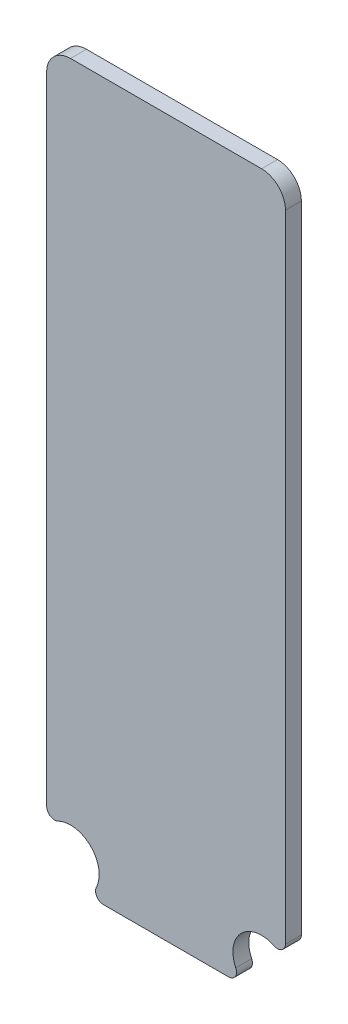
ISO-10303-21;
HEADER;
FILE_DESCRIPTION(('STEP AP214'),'2;1');
FILE_NAME('part.step','',(''),(''),'','','');
FILE_SCHEMA(('AUTOMOTIVE_DESIGN { 1 0 10303 214 1 1 1 1 }'));
ENDSEC;
DATA;
#1=APPLICATION_CONTEXT('core data for automotive mechanical design processes');
#2=APPLICATION_PROTOCOL_DEFINITION('international standard','automotive_design',2000,#1);
#3=PRODUCT_CONTEXT('',#1,'mechanical');
#4=PRODUCT('Part','Part','',(#3));
#5=PRODUCT_RELATED_PRODUCT_CATEGORY('part','',(#4));
#6=PRODUCT_DEFINITION_FORMATION('','',#4);
#7=PRODUCT_DEFINITION_CONTEXT('part definition',#1,'design');
#8=PRODUCT_DEFINITION('design','',#6,#7);
#9=PRODUCT_DEFINITION_SHAPE('','',#8);
#10=(LENGTH_UNIT() NAMED_UNIT(*) SI_UNIT(.MILLI.,.METRE.));
#11=(NAMED_UNIT(*) PLANE_ANGLE_UNIT() SI_UNIT($,.RADIAN.));
#12=(NAMED_UNIT(*) SI_UNIT($,.STERADIAN.) SOLID_ANGLE_UNIT());
#13=UNCERTAINTY_MEASURE_WITH_UNIT(LENGTH_MEASURE(1.E-05),#10,'distance_accuracy_value','');
#14=(GEOMETRIC_REPRESENTATION_CONTEXT(3) GLOBAL_UNCERTAINTY_ASSIGNED_CONTEXT((#13)) GLOBAL_UNIT_ASSIGNED_CONTEXT((#10,
#11,#12)) REPRESENTATION_CONTEXT('',''));
#15=CARTESIAN_POINT('',(0.,0.,0.));
#16=DIRECTION('',(0.,0.,1.));
#17=DIRECTION('',(1.,0.,0.));
#18=AXIS2_PLACEMENT_3D('',#15,#16,#17);
#19=CARTESIAN_POINT('',(200.687540360122,66.4697315181408,1.98107154156));
#20=DIRECTION('',(0.,0.,1.));
#21=DIRECTION('',(0.,-1.,0.));
#22=AXIS2_PLACEMENT_3D('',#19,#20,#21);
#23=CYLINDRICAL_SURFACE('',#22,0.5);
#24=CARTESIAN_POINT('',(200.687540360122,66.4697315181408,1.98107154156));
#25=DIRECTION('',(0.,0.,-1.));
#26=DIRECTION('',(1.,0.,0.));
#27=AXIS2_PLACEMENT_3D('',#24,#25,#26);
#28=CIRCLE('',#27,0.5);
#29=CARTESIAN_POINT('',(201.187540360122,66.4697315181408,1.98107154156));
#30=VERTEX_POINT('',#29);
#31=CARTESIAN_POINT('',(200.470149055774,66.0194637968971,1.98107154156));
#32=VERTEX_POINT('',#31);
#33=EDGE_CURVE('E163',#30,#32,#28,.T.);
#34=ORIENTED_EDGE('',*,*,#33,.F.);
#35=DIRECTION('',(0.,0.,1.));
#36=VECTOR('',#35,1.);
#37=CARTESIAN_POINT('',(201.187540360122,66.4697315181408,1.98107154156));
#38=LINE('',#37,#36);
#39=CARTESIAN_POINT('',(201.187540360122,66.4697315181408,2.98107154156));
#40=VERTEX_POINT('',#39);
#41=EDGE_CURVE('E193',#30,#40,#38,.T.);
#42=ORIENTED_EDGE('',*,*,#41,.T.);
#43=CARTESIAN_POINT('',(200.687540360122,66.4697315181408,2.98107154156));
#44=DIRECTION('',(0.,0.,1.));
#45=DIRECTION('',(-0.434782608695272,-0.900535442487487,0.));
#46=AXIS2_PLACEMENT_3D('',#43,#44,#45);
#47=CIRCLE('',#46,0.5);
#48=CARTESIAN_POINT('',(200.470149055774,66.0194637968972,2.98107154156));
#49=VERTEX_POINT('',#48);
#50=EDGE_CURVE('E185',#49,#40,#47,.T.);
#51=ORIENTED_EDGE('',*,*,#50,.F.);
#52=DIRECTION('',(0.,0.,-1.));
#53=VECTOR('',#52,1.);
#54=CARTESIAN_POINT('',(200.470149055774,66.0194637968972,2.98107154156));
#55=LINE('',#54,#53);
#56=EDGE_CURVE('E11',#49,#32,#55,.T.);
#57=ORIENTED_EDGE('',*,*,#56,.T.);
#58=EDGE_LOOP('',(#34,#42,#51,#57));
#59=FACE_BOUND('',#58,.T.);
#60=ADVANCED_FACE('F36',(#59),#23,.T.);
#61=CARTESIAN_POINT('',(199.687540360122,64.39850000042,1.98107154156));
#62=DIRECTION('',(0.,0.,1.));
#63=DIRECTION('',(0.,-1.,0.));
#64=AXIS2_PLACEMENT_3D('',#61,#62,#63);
#65=CYLINDRICAL_SURFACE('',#64,1.8);
#66=CARTESIAN_POINT('',(199.687540360122,64.39850000042,2.98107154156));
#67=DIRECTION('',(0.,0.,-1.));
#68=DIRECTION('',(-0.90053544248737,-0.434782608695514,0.));
#69=AXIS2_PLACEMENT_3D('',#66,#67,#68);
#70=CIRCLE('',#69,1.8);
#71=CARTESIAN_POINT('',(198.066576563645,63.6158913047679,2.98107154156));
#72=VERTEX_POINT('',#71);
#73=EDGE_CURVE('E190',#72,#49,#70,.T.);
#74=ORIENTED_EDGE('',*,*,#73,.F.);
#75=DIRECTION('',(0.,0.,-1.));
#76=VECTOR('',#75,1.);
#77=CARTESIAN_POINT('',(198.066576563645,63.6158913047679,2.98107154156));
#78=LINE('',#77,#76);
#79=CARTESIAN_POINT('',(198.066576563645,63.615891304768,1.98107154156));
#80=VERTEX_POINT('',#79);
#81=EDGE_CURVE('E46',#72,#80,#78,.T.);
#82=ORIENTED_EDGE('',*,*,#81,.T.);
#83=CARTESIAN_POINT('',(199.687540360122,64.39850000042,1.98107154156));
#84=DIRECTION('',(0.,0.,1.));
#85=DIRECTION('',(0.434782608695757,0.900535442487253,0.));
#86=AXIS2_PLACEMENT_3D('',#83,#84,#85);
#87=CIRCLE('',#86,1.8);
#88=EDGE_CURVE('E147',#32,#80,#87,.T.);
#89=ORIENTED_EDGE('',*,*,#88,.F.);
#90=ORIENTED_EDGE('',*,*,#56,.F.);
#91=EDGE_LOOP('',(#74,#82,#89,#90));
#92=FACE_BOUND('',#91,.T.);
#93=ADVANCED_FACE('F237',(#92),#65,.F.);
#94=CARTESIAN_POINT('',(197.616308842401,63.39850000042,1.98107154156));
#95=DIRECTION('',(0.,0.,1.));
#96=DIRECTION('',(0.,-1.,0.));
#97=AXIS2_PLACEMENT_3D('',#94,#95,#96);
#98=CYLINDRICAL_SURFACE('',#97,0.5);
#99=CARTESIAN_POINT('',(197.616308842401,63.39850000042,2.98107154156));
#100=DIRECTION('',(0.,0.,1.));
#101=DIRECTION('',(0.,-1.,0.));
#102=AXIS2_PLACEMENT_3D('',#99,#100,#101);
#103=CIRCLE('',#102,0.5);
#104=CARTESIAN_POINT('',(197.616308842401,62.89850000042,2.98107154156));
#105=VERTEX_POINT('',#104);
#106=EDGE_CURVE('E187',#105,#72,#103,.T.);
#107=ORIENTED_EDGE('',*,*,#106,.F.);
#108=DIRECTION('',(0.,0.,-1.));
#109=VECTOR('',#108,1.);
#110=CARTESIAN_POINT('',(197.616308842401,62.89850000042,2.98107154156));
#111=LINE('',#110,#109);
#112=CARTESIAN_POINT('',(197.616308842401,62.89850000042,1.98107154156));
#113=VERTEX_POINT('',#112);
#114=EDGE_CURVE('E131',#105,#113,#111,.T.);
#115=ORIENTED_EDGE('',*,*,#114,.T.);
#116=CARTESIAN_POINT('',(197.616308842401,63.39850000042,1.98107154156));
#117=DIRECTION('',(0.,0.,-1.));
#118=DIRECTION('',(0.900535442487063,0.43478260869615,0.));
#119=AXIS2_PLACEMENT_3D('',#116,#117,#118);
#120=CIRCLE('',#119,0.5);
#121=EDGE_CURVE('E145',#80,#113,#120,.T.);
#122=ORIENTED_EDGE('',*,*,#121,.F.);
#123=ORIENTED_EDGE('',*,*,#81,.F.);
#124=EDGE_LOOP('',(#107,#115,#122,#123));
#125=FACE_BOUND('',#124,.T.);
#126=ADVANCED_FACE('F209',(#125),#98,.T.);
#127=CARTESIAN_POINT('',(189.758771877843,62.89850000042,1.98107154156));
#128=DIRECTION('',(0.,1.,0.));
#129=DIRECTION('',(1.,0.,0.));
#130=AXIS2_PLACEMENT_3D('',#127,#128,#129);
#131=PLANE('',#130);
#132=DIRECTION('',(1.,0.,0.));
#133=VECTOR('',#132,1.);
#134=CARTESIAN_POINT('',(189.758771877843,62.89850000042,2.98107154156));
#135=LINE('',#134,#133);
#136=CARTESIAN_POINT('',(189.758771877843,62.89850000042,2.98107154156));
#137=VERTEX_POINT('',#136);
#138=EDGE_CURVE('E40',#137,#105,#135,.T.);
#139=ORIENTED_EDGE('',*,*,#138,.F.);
#140=DIRECTION('',(0.,0.,1.));
#141=VECTOR('',#140,1.);
#142=CARTESIAN_POINT('',(189.758771877843,62.89850000042,1.98107154156));
#143=LINE('',#142,#141);
#144=CARTESIAN_POINT('',(189.758771877843,62.89850000042,1.98107154156));
#145=VERTEX_POINT('',#144);
#146=EDGE_CURVE('E121',#145,#137,#143,.T.);
#147=ORIENTED_EDGE('',*,*,#146,.F.);
#148=DIRECTION('',(1.,0.,0.));
#149=VECTOR('',#148,1.);
#150=CARTESIAN_POINT('',(189.758771877843,62.89850000042,1.98107154156));
#151=LINE('',#150,#149);
#152=EDGE_CURVE('E125',#145,#113,#151,.T.);
#153=ORIENTED_EDGE('',*,*,#152,.T.);
#154=ORIENTED_EDGE('',*,*,#114,.F.);
#155=EDGE_LOOP('',(#139,#147,#153,#154));
#156=FACE_BOUND('',#155,.T.);
#157=ADVANCED_FACE('F123',(#156),#131,.F.);
#158=CARTESIAN_POINT('',(189.758771877843,63.39850000042,1.98107154156));
#159=DIRECTION('',(0.,0.,1.));
#160=DIRECTION('',(0.,-1.,0.));
#161=AXIS2_PLACEMENT_3D('',#158,#159,#160);
#162=CYLINDRICAL_SURFACE('',#161,0.5);
#163=CARTESIAN_POINT('',(189.758771877843,63.39850000042,2.98107154156));
#164=DIRECTION('',(0.,0.,1.));
#165=DIRECTION('',(-0.900535442487295,0.43478260869567,0.));
#166=AXIS2_PLACEMENT_3D('',#163,#164,#165);
#167=CIRCLE('',#166,0.5);
#168=CARTESIAN_POINT('',(189.308504156599,63.6158913047679,2.98107154156));
#169=VERTEX_POINT('',#168);
#170=EDGE_CURVE('E171',#169,#137,#167,.T.);
#171=ORIENTED_EDGE('',*,*,#170,.F.);
#172=DIRECTION('',(0.,0.,-1.));
#173=VECTOR('',#172,1.);
#174=CARTESIAN_POINT('',(189.308504156599,63.6158913047679,2.98107154156));
#175=LINE('',#174,#173);
#176=CARTESIAN_POINT('',(189.308504156599,63.6158913047679,1.98107154156));
#177=VERTEX_POINT('',#176);
#178=EDGE_CURVE('E132',#169,#177,#175,.T.);
#179=ORIENTED_EDGE('',*,*,#178,.T.);
#180=CARTESIAN_POINT('',(189.758771877843,63.39850000042,1.98107154156));
#181=DIRECTION('',(0.,0.,-1.));
#182=DIRECTION('',(0.,-1.,0.));
#183=AXIS2_PLACEMENT_3D('',#180,#181,#182);
#184=CIRCLE('',#183,0.5);
#185=EDGE_CURVE('E135',#145,#177,#184,.T.);
#186=ORIENTED_EDGE('',*,*,#185,.F.);
#187=ORIENTED_EDGE('',*,*,#146,.T.);
#188=EDGE_LOOP('',(#171,#179,#186,#187));
#189=FACE_BOUND('',#188,.T.);
#190=ADVANCED_FACE('F136',(#189),#162,.T.);
#191=CARTESIAN_POINT('',(187.687540360122,64.39850000042,1.98107154156));
#192=DIRECTION('',(0.,0.,1.));
#193=DIRECTION('',(0.,-1.,0.));
#194=AXIS2_PLACEMENT_3D('',#191,#192,#193);
#195=CYLINDRICAL_SURFACE('',#194,1.8);
#196=CARTESIAN_POINT('',(187.687540360122,64.39850000042,2.98107154156));
#197=DIRECTION('',(0.,0.,-1.));
#198=DIRECTION('',(-0.434782608695684,0.900535442487288,0.));
#199=AXIS2_PLACEMENT_3D('',#196,#197,#198);
#200=CIRCLE('',#199,1.8);
#201=CARTESIAN_POINT('',(186.90493166447,66.0194637968972,2.98107154156));
#202=VERTEX_POINT('',#201);
#203=EDGE_CURVE('E173',#202,#169,#200,.T.);
#204=ORIENTED_EDGE('',*,*,#203,.F.);
#205=DIRECTION('',(0.,0.,-1.));
#206=VECTOR('',#205,1.);
#207=CARTESIAN_POINT('',(186.90493166447,66.0194637968972,2.98107154156));
#208=LINE('',#207,#206);
#209=CARTESIAN_POINT('',(186.90493166447,66.0194637968972,1.98107154156));
#210=VERTEX_POINT('',#209);
#211=EDGE_CURVE('E55',#202,#210,#208,.T.);
#212=ORIENTED_EDGE('',*,*,#211,.T.);
#213=CARTESIAN_POINT('',(187.687540360122,64.39850000042,1.98107154156));
#214=DIRECTION('',(0.,0.,1.));
#215=DIRECTION('',(0.900535442487306,-0.434782608695648,0.));
#216=AXIS2_PLACEMENT_3D('',#213,#214,#215);
#217=CIRCLE('',#216,1.8);
#218=EDGE_CURVE('E139',#177,#210,#217,.T.);
#219=ORIENTED_EDGE('',*,*,#218,.F.);
#220=ORIENTED_EDGE('',*,*,#178,.F.);
#221=EDGE_LOOP('',(#204,#212,#219,#220));
#222=FACE_BOUND('',#221,.T.);
#223=ADVANCED_FACE('F253',(#222),#195,.F.);
#224=CARTESIAN_POINT('',(201.187540360122,66.4697315181408,1.98107154156));
#225=DIRECTION('',(-1.,0.,0.));
#226=DIRECTION('',(0.,0.,1.));
#227=AXIS2_PLACEMENT_3D('',#224,#225,#226);
#228=PLANE('',#227);
#229=DIRECTION('',(0.,1.,0.));
#230=VECTOR('',#229,1.);
#231=CARTESIAN_POINT('',(201.187540360122,66.4697315181408,2.98107154156));
#232=LINE('',#231,#230);
#233=CARTESIAN_POINT('',(201.187540360122,106.39850000042,2.98107154156));
#234=VERTEX_POINT('',#233);
#235=EDGE_CURVE('E181',#40,#234,#232,.T.);
#236=ORIENTED_EDGE('',*,*,#235,.F.);
#237=ORIENTED_EDGE('',*,*,#41,.F.);
#238=DIRECTION('',(0.,1.,0.));
#239=VECTOR('',#238,1.);
#240=CARTESIAN_POINT('',(201.187540360122,66.4697315181408,1.98107154156));
#241=LINE('',#240,#239);
#242=CARTESIAN_POINT('',(201.187540360122,106.39850000042,1.98107154156));
#243=VERTEX_POINT('',#242);
#244=EDGE_CURVE('E161',#30,#243,#241,.T.);
#245=ORIENTED_EDGE('',*,*,#244,.T.);
#246=DIRECTION('',(0.,0.,-1.));
#247=VECTOR('',#246,1.);
#248=CARTESIAN_POINT('',(201.187540360122,106.39850000042,2.98107154156));
#249=LINE('',#248,#247);
#250=EDGE_CURVE('E184',#234,#243,#249,.T.);
#251=ORIENTED_EDGE('',*,*,#250,.F.);
#252=EDGE_LOOP('',(#236,#237,#245,#251));
#253=FACE_BOUND('',#252,.T.);
#254=ADVANCED_FACE('F255',(#253),#228,.F.);
#255=CARTESIAN_POINT('',(186.687540360122,66.4697315181408,1.98107154156));
#256=DIRECTION('',(0.,0.,1.));
#257=DIRECTION('',(0.,-1.,0.));
#258=AXIS2_PLACEMENT_3D('',#255,#256,#257);
#259=CYLINDRICAL_SURFACE('',#258,0.5);
#260=CARTESIAN_POINT('',(186.687540360122,66.4697315181408,1.98107154156));
#261=DIRECTION('',(0.,0.,-1.));
#262=DIRECTION('',(0.434782608695541,-0.900535442487357,0.));
#263=AXIS2_PLACEMENT_3D('',#260,#261,#262);
#264=CIRCLE('',#263,0.5);
#265=CARTESIAN_POINT('',(186.187540360122,66.4697315181408,1.98107154156));
#266=VERTEX_POINT('',#265);
#267=EDGE_CURVE('E177',#210,#266,#264,.T.);
#268=ORIENTED_EDGE('',*,*,#267,.F.);
#269=ORIENTED_EDGE('',*,*,#211,.F.);
#270=CARTESIAN_POINT('',(186.687540360122,66.4697315181408,2.98107154156));
#271=DIRECTION('',(0.,0.,1.));
#272=DIRECTION('',(-1.,0.,0.));
#273=AXIS2_PLACEMENT_3D('',#270,#271,#272);
#274=CIRCLE('',#273,0.5);
#275=CARTESIAN_POINT('',(186.187540360122,66.4697315181408,2.98107154156));
#276=VERTEX_POINT('',#275);
#277=EDGE_CURVE('E178',#276,#202,#274,.T.);
#278=ORIENTED_EDGE('',*,*,#277,.F.);
#279=DIRECTION('',(0.,0.,-1.));
#280=VECTOR('',#279,1.);
#281=CARTESIAN_POINT('',(186.187540360122,66.4697315181408,2.98107154156));
#282=LINE('',#281,#280);
#283=EDGE_CURVE('E170',#276,#266,#282,.T.);
#284=ORIENTED_EDGE('',*,*,#283,.T.);
#285=EDGE_LOOP('',(#268,#269,#278,#284));
#286=FACE_BOUND('',#285,.T.);
#287=ADVANCED_FACE('F252',(#286),#259,.T.);
#288=CARTESIAN_POINT('',(199.687540360122,106.39850000042,1.98107154156));
#289=DIRECTION('',(0.,0.,-1.));
#290=DIRECTION('',(0.,1.,0.));
#291=AXIS2_PLACEMENT_3D('',#288,#289,#290);
#292=PLANE('',#291);
#293=CARTESIAN_POINT('',(199.687540360122,106.39850000042,1.98107154156));
#294=DIRECTION('',(0.,0.,-1.));
#295=DIRECTION('',(0.,1.,0.));
#296=AXIS2_PLACEMENT_3D('',#293,#294,#295);
#297=CIRCLE('',#296,1.5);
#298=CARTESIAN_POINT('',(199.687540360122,107.89850000042,1.98107154156));
#299=VERTEX_POINT('',#298);
#300=EDGE_CURVE('E200',#299,#243,#297,.T.);
#301=ORIENTED_EDGE('',*,*,#300,.T.);
#302=ORIENTED_EDGE('',*,*,#244,.F.);
#303=ORIENTED_EDGE('',*,*,#33,.T.);
#304=ORIENTED_EDGE('',*,*,#88,.T.);
#305=ORIENTED_EDGE('',*,*,#121,.T.);
#306=ORIENTED_EDGE('',*,*,#152,.F.);
#307=ORIENTED_EDGE('',*,*,#185,.T.);
#308=ORIENTED_EDGE('',*,*,#218,.T.);
#309=ORIENTED_EDGE('',*,*,#267,.T.);
#310=DIRECTION('',(0.,-1.,0.));
#311=VECTOR('',#310,1.);
#312=CARTESIAN_POINT('',(186.187540360122,106.39850000042,1.98107154156));
#313=LINE('',#312,#311);
#314=CARTESIAN_POINT('',(186.187540360122,106.39850000042,1.98107154156));
#315=VERTEX_POINT('',#314);
#316=EDGE_CURVE('E167',#315,#266,#313,.T.);
#317=ORIENTED_EDGE('',*,*,#316,.F.);
#318=CARTESIAN_POINT('',(187.687540360122,106.39850000042,1.98107154156));
#319=DIRECTION('',(0.,0.,-1.));
#320=DIRECTION('',(-1.,0.,0.));
#321=AXIS2_PLACEMENT_3D('',#318,#319,#320);
#322=CIRCLE('',#321,1.5);
#323=CARTESIAN_POINT('',(187.687540360122,107.89850000042,1.98107154156));
#324=VERTEX_POINT('',#323);
#325=EDGE_CURVE('E164',#315,#324,#322,.T.);
#326=ORIENTED_EDGE('',*,*,#325,.T.);
#327=DIRECTION('',(-1.,0.,0.));
#328=VECTOR('',#327,1.);
#329=CARTESIAN_POINT('',(199.687540360122,107.89850000042,1.98107154156));
#330=LINE('',#329,#328);
#331=EDGE_CURVE('E219',#299,#324,#330,.T.);
#332=ORIENTED_EDGE('',*,*,#331,.F.);
#333=EDGE_LOOP('',(#301,#302,#303,#304,#305,#306,#307,#308,#309,#317,#326,#332));
#334=FACE_BOUND('',#333,.T.);
#335=ADVANCED_FACE('F142',(#334),#292,.T.);
#336=CARTESIAN_POINT('',(187.687540360122,106.39850000042,1.98107154156));
#337=DIRECTION('',(0.,0.,1.));
#338=DIRECTION('',(0.,-1.,0.));
#339=AXIS2_PLACEMENT_3D('',#336,#337,#338);
#340=CYLINDRICAL_SURFACE('',#339,1.5);
#341=CARTESIAN_POINT('',(187.687540360122,106.39850000042,2.98107154156));
#342=DIRECTION('',(0.,0.,1.));
#343=DIRECTION('',(0.,1.,0.));
#344=AXIS2_PLACEMENT_3D('',#341,#342,#343);
#345=CIRCLE('',#344,1.5);
#346=CARTESIAN_POINT('',(187.687540360122,107.89850000042,2.98107154156));
#347=VERTEX_POINT('',#346);
#348=CARTESIAN_POINT('',(186.187540360122,106.39850000042,2.98107154156));
#349=VERTEX_POINT('',#348);
#350=EDGE_CURVE('E151',#347,#349,#345,.T.);
#351=ORIENTED_EDGE('',*,*,#350,.F.);
#352=DIRECTION('',(0.,0.,-1.));
#353=VECTOR('',#352,1.);
#354=CARTESIAN_POINT('',(187.687540360122,107.89850000042,2.98107154156));
#355=LINE('',#354,#353);
#356=EDGE_CURVE('E206',#347,#324,#355,.T.);
#357=ORIENTED_EDGE('',*,*,#356,.T.);
#358=ORIENTED_EDGE('',*,*,#325,.F.);
#359=DIRECTION('',(0.,0.,1.));
#360=VECTOR('',#359,1.);
#361=CARTESIAN_POINT('',(186.187540360122,106.39850000042,1.98107154156));
#362=LINE('',#361,#360);
#363=EDGE_CURVE('E156',#315,#349,#362,.T.);
#364=ORIENTED_EDGE('',*,*,#363,.T.);
#365=EDGE_LOOP('',(#351,#357,#358,#364));
#366=FACE_BOUND('',#365,.T.);
#367=ADVANCED_FACE('F38',(#366),#340,.T.);
#368=CARTESIAN_POINT('',(199.687540360122,107.89850000042,1.98107154156));
#369=DIRECTION('',(0.,-1.,0.));
#370=DIRECTION('',(0.,0.,-1.));
#371=AXIS2_PLACEMENT_3D('',#368,#369,#370);
#372=PLANE('',#371);
#373=DIRECTION('',(-1.,0.,0.));
#374=VECTOR('',#373,1.);
#375=CARTESIAN_POINT('',(199.687540360122,107.89850000042,2.98107154156));
#376=LINE('',#375,#374);
#377=CARTESIAN_POINT('',(199.687540360122,107.89850000042,2.98107154156));
#378=VERTEX_POINT('',#377);
#379=EDGE_CURVE('E157',#378,#347,#376,.T.);
#380=ORIENTED_EDGE('',*,*,#379,.F.);
#381=DIRECTION('',(0.,0.,1.));
#382=VECTOR('',#381,1.);
#383=CARTESIAN_POINT('',(199.687540360122,107.89850000042,1.98107154156));
#384=LINE('',#383,#382);
#385=EDGE_CURVE('E223',#299,#378,#384,.T.);
#386=ORIENTED_EDGE('',*,*,#385,.F.);
#387=ORIENTED_EDGE('',*,*,#331,.T.);
#388=ORIENTED_EDGE('',*,*,#356,.F.);
#389=EDGE_LOOP('',(#380,#386,#387,#388));
#390=FACE_BOUND('',#389,.T.);
#391=ADVANCED_FACE('F245',(#390),#372,.F.);
#392=CARTESIAN_POINT('',(199.687540360122,106.39850000042,1.98107154156));
#393=DIRECTION('',(0.,0.,1.));
#394=DIRECTION('',(0.,-1.,0.));
#395=AXIS2_PLACEMENT_3D('',#392,#393,#394);
#396=CYLINDRICAL_SURFACE('',#395,1.5);
#397=CARTESIAN_POINT('',(199.687540360122,106.39850000042,2.98107154156));
#398=DIRECTION('',(0.,0.,1.));
#399=DIRECTION('',(1.,0.,0.));
#400=AXIS2_PLACEMENT_3D('',#397,#398,#399);
#401=CIRCLE('',#400,1.5);
#402=EDGE_CURVE('E160',#234,#378,#401,.T.);
#403=ORIENTED_EDGE('',*,*,#402,.F.);
#404=ORIENTED_EDGE('',*,*,#250,.T.);
#405=ORIENTED_EDGE('',*,*,#300,.F.);
#406=ORIENTED_EDGE('',*,*,#385,.T.);
#407=EDGE_LOOP('',(#403,#404,#405,#406));
#408=FACE_BOUND('',#407,.T.);
#409=ADVANCED_FACE('F242',(#408),#396,.T.);
#410=CARTESIAN_POINT('',(199.687540360122,106.39850000042,2.98107154156));
#411=DIRECTION('',(0.,0.,-1.));
#412=DIRECTION('',(0.,1.,0.));
#413=AXIS2_PLACEMENT_3D('',#410,#411,#412);
#414=PLANE('',#413);
#415=ORIENTED_EDGE('',*,*,#402,.T.);
#416=ORIENTED_EDGE('',*,*,#379,.T.);
#417=ORIENTED_EDGE('',*,*,#350,.T.);
#418=DIRECTION('',(0.,-1.,0.));
#419=VECTOR('',#418,1.);
#420=CARTESIAN_POINT('',(186.187540360122,106.39850000042,2.98107154156));
#421=LINE('',#420,#419);
#422=EDGE_CURVE('E153',#349,#276,#421,.T.);
#423=ORIENTED_EDGE('',*,*,#422,.T.);
#424=ORIENTED_EDGE('',*,*,#277,.T.);
#425=ORIENTED_EDGE('',*,*,#203,.T.);
#426=ORIENTED_EDGE('',*,*,#170,.T.);
#427=ORIENTED_EDGE('',*,*,#138,.T.);
#428=ORIENTED_EDGE('',*,*,#106,.T.);
#429=ORIENTED_EDGE('',*,*,#73,.T.);
#430=ORIENTED_EDGE('',*,*,#50,.T.);
#431=ORIENTED_EDGE('',*,*,#235,.T.);
#432=EDGE_LOOP('',(#415,#416,#417,#423,#424,#425,#426,#427,#428,#429,#430,#431));
#433=FACE_BOUND('',#432,.T.);
#434=ADVANCED_FACE('F213',(#433),#414,.F.);
#435=CARTESIAN_POINT('',(186.187540360122,106.39850000042,1.98107154156));
#436=DIRECTION('',(1.,0.,0.));
#437=DIRECTION('',(0.,1.,0.));
#438=AXIS2_PLACEMENT_3D('',#435,#436,#437);
#439=PLANE('',#438);
#440=ORIENTED_EDGE('',*,*,#422,.F.);
#441=ORIENTED_EDGE('',*,*,#363,.F.);
#442=ORIENTED_EDGE('',*,*,#316,.T.);
#443=ORIENTED_EDGE('',*,*,#283,.F.);
#444=EDGE_LOOP('',(#440,#441,#442,#443));
#445=FACE_BOUND('',#444,.T.);
#446=ADVANCED_FACE('F250',(#445),#439,.F.);
#447=CLOSED_SHELL('',(#60,#93,#126,#157,#190,#223,#254,#287,#335,#367,#391,#409,#434,#446));
#448=MANIFOLD_SOLID_BREP('B2',#447);
#449=ADVANCED_BREP_SHAPE_REPRESENTATION('',(#18,#448),#14);
#450=SHAPE_DEFINITION_REPRESENTATION(#9,#449);
ENDSEC;
END-ISO-10303-21;
